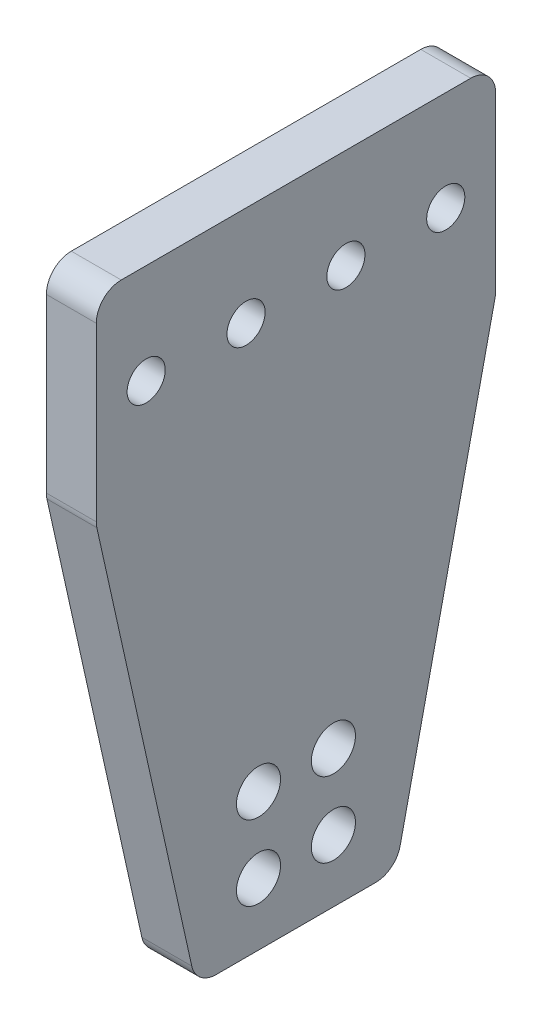
ISO-10303-21;
HEADER;
FILE_DESCRIPTION(('STEP AP214'),'2;1');
FILE_NAME('part.step','',(''),(''),'','','');
FILE_SCHEMA(('AUTOMOTIVE_DESIGN { 1 0 10303 214 1 1 1 1 }'));
ENDSEC;
DATA;
#1=APPLICATION_CONTEXT('core data for automotive mechanical design processes');
#2=APPLICATION_PROTOCOL_DEFINITION('international standard','automotive_design',2000,#1);
#3=PRODUCT_CONTEXT('',#1,'mechanical');
#4=PRODUCT('Part','Part','',(#3));
#5=PRODUCT_RELATED_PRODUCT_CATEGORY('part','',(#4));
#6=PRODUCT_DEFINITION_FORMATION('','',#4);
#7=PRODUCT_DEFINITION_CONTEXT('part definition',#1,'design');
#8=PRODUCT_DEFINITION('design','',#6,#7);
#9=PRODUCT_DEFINITION_SHAPE('','',#8);
#10=(LENGTH_UNIT() NAMED_UNIT(*) SI_UNIT(.MILLI.,.METRE.));
#11=(NAMED_UNIT(*) PLANE_ANGLE_UNIT() SI_UNIT($,.RADIAN.));
#12=(NAMED_UNIT(*) SI_UNIT($,.STERADIAN.) SOLID_ANGLE_UNIT());
#13=UNCERTAINTY_MEASURE_WITH_UNIT(LENGTH_MEASURE(1.E-05),#10,'distance_accuracy_value','');
#14=(GEOMETRIC_REPRESENTATION_CONTEXT(3) GLOBAL_UNCERTAINTY_ASSIGNED_CONTEXT((#13)) GLOBAL_UNIT_ASSIGNED_CONTEXT((#10,
#11,#12)) REPRESENTATION_CONTEXT('',''));
#15=CARTESIAN_POINT('',(0.,0.,0.));
#16=DIRECTION('',(0.,0.,1.));
#17=DIRECTION('',(1.,0.,0.));
#18=AXIS2_PLACEMENT_3D('',#15,#16,#17);
#19=CARTESIAN_POINT('',(-285.75,-53.975,1117.6));
#20=DIRECTION('',(0.,-0.216930457818659,0.976187060183952));
#21=DIRECTION('',(0.,-0.976187060183952,-0.216930457818659));
#22=AXIS2_PLACEMENT_3D('',#19,#20,#21);
#23=PLANE('',#22);
#24=DIRECTION('',(0.,-0.976187060183952,-0.216930457818659));
#25=VECTOR('',#24,1.);
#26=CARTESIAN_POINT('',(-279.4,-53.975,1117.6));
#27=LINE('',#26,#25);
#28=CARTESIAN_POINT('',(-279.4,-25.740227377622,1123.87439391608));
#29=VERTEX_POINT('',#28);
#30=CARTESIAN_POINT('',(-279.4,-80.0637542035742,1111.80249906587));
#31=VERTEX_POINT('',#30);
#32=EDGE_CURVE('E195',#29,#31,#27,.T.);
#33=ORIENTED_EDGE('',*,*,#32,.F.);
#34=DIRECTION('',(1.,0.,0.));
#35=VECTOR('',#34,1.);
#36=CARTESIAN_POINT('',(-285.75,-25.740227377622,1123.87439391608));
#37=LINE('',#36,#35);
#38=CARTESIAN_POINT('',(-285.75,-25.740227377622,1123.87439391608));
#39=VERTEX_POINT('',#38);
#40=EDGE_CURVE('E157',#29,#39,#37,.F.);
#41=ORIENTED_EDGE('',*,*,#40,.T.);
#42=DIRECTION('',(0.,-0.976187060183952,-0.216930457818659));
#43=VECTOR('',#42,1.);
#44=CARTESIAN_POINT('',(-285.75,-53.975,1117.6));
#45=LINE('',#44,#43);
#46=CARTESIAN_POINT('',(-285.75,-80.0637542035742,1111.80249906587));
#47=VERTEX_POINT('',#46);
#48=EDGE_CURVE('E222',#39,#47,#45,.T.);
#49=ORIENTED_EDGE('',*,*,#48,.T.);
#50=DIRECTION('',(1.,0.,0.));
#51=VECTOR('',#50,1.);
#52=CARTESIAN_POINT('',(-285.75,-80.0637542035742,1111.80249906587));
#53=LINE('',#52,#51);
#54=EDGE_CURVE('E154',#47,#31,#53,.T.);
#55=ORIENTED_EDGE('',*,*,#54,.T.);
#56=EDGE_LOOP('',(#33,#41,#49,#55));
#57=FACE_BOUND('',#56,.T.);
#58=ADVANCED_FACE('F17',(#57),#23,.T.);
#59=CARTESIAN_POINT('',(-285.75,-12.7,1123.95));
#60=DIRECTION('',(0.,0.,1.));
#61=DIRECTION('',(1.,0.,0.));
#62=AXIS2_PLACEMENT_3D('',#59,#60,#61);
#63=PLANE('',#62);
#64=DIRECTION('',(0.,-1.,0.));
#65=VECTOR('',#64,1.);
#66=CARTESIAN_POINT('',(-285.75,-12.7,1123.95));
#67=LINE('',#66,#65);
#68=CARTESIAN_POINT('',(-285.75,-3.175,1123.95));
#69=VERTEX_POINT('',#68);
#70=CARTESIAN_POINT('',(-285.75,-25.0514731740477,1123.95));
#71=VERTEX_POINT('',#70);
#72=EDGE_CURVE('E238',#69,#71,#67,.T.);
#73=ORIENTED_EDGE('',*,*,#72,.T.);
#74=DIRECTION('',(1.,0.,0.));
#75=VECTOR('',#74,1.);
#76=CARTESIAN_POINT('',(-285.75,-25.0514731740477,1123.95));
#77=LINE('',#76,#75);
#78=CARTESIAN_POINT('',(-279.4,-25.0514731740477,1123.95));
#79=VERTEX_POINT('',#78);
#80=EDGE_CURVE('E130',#71,#79,#77,.T.);
#81=ORIENTED_EDGE('',*,*,#80,.T.);
#82=DIRECTION('',(0.,-1.,0.));
#83=VECTOR('',#82,1.);
#84=CARTESIAN_POINT('',(-279.4,-12.7,1123.95));
#85=LINE('',#84,#83);
#86=CARTESIAN_POINT('',(-279.4,-3.175,1123.95));
#87=VERTEX_POINT('',#86);
#88=EDGE_CURVE('E114',#87,#79,#85,.T.);
#89=ORIENTED_EDGE('',*,*,#88,.F.);
#90=DIRECTION('',(1.,0.,0.));
#91=VECTOR('',#90,1.);
#92=CARTESIAN_POINT('',(-285.75,-3.175,1123.95));
#93=LINE('',#92,#91);
#94=EDGE_CURVE('E127',#87,#69,#93,.F.);
#95=ORIENTED_EDGE('',*,*,#94,.T.);
#96=EDGE_LOOP('',(#73,#81,#89,#95));
#97=FACE_BOUND('',#96,.T.);
#98=ADVANCED_FACE('F126',(#97),#63,.T.);
#99=CARTESIAN_POINT('',(-285.75,0.,622.3));
#100=DIRECTION('',(0.,1.,0.));
#101=DIRECTION('',(0.,0.,1.));
#102=AXIS2_PLACEMENT_3D('',#99,#100,#101);
#103=PLANE('',#102);
#104=DIRECTION('',(0.,0.,1.));
#105=VECTOR('',#104,1.);
#106=CARTESIAN_POINT('',(-285.75,0.,622.3));
#107=LINE('',#106,#105);
#108=CARTESIAN_POINT('',(-285.75,0.,1076.325));
#109=VERTEX_POINT('',#108);
#110=CARTESIAN_POINT('',(-285.75,0.,1120.775));
#111=VERTEX_POINT('',#110);
#112=EDGE_CURVE('E240',#109,#111,#107,.T.);
#113=ORIENTED_EDGE('',*,*,#112,.T.);
#114=DIRECTION('',(1.,0.,0.));
#115=VECTOR('',#114,1.);
#116=CARTESIAN_POINT('',(-285.75,0.,1120.775));
#117=LINE('',#116,#115);
#118=CARTESIAN_POINT('',(-279.4,0.,1120.775));
#119=VERTEX_POINT('',#118);
#120=EDGE_CURVE('E11',#111,#119,#117,.T.);
#121=ORIENTED_EDGE('',*,*,#120,.T.);
#122=DIRECTION('',(0.,0.,1.));
#123=VECTOR('',#122,1.);
#124=CARTESIAN_POINT('',(-279.4,0.,622.3));
#125=LINE('',#124,#123);
#126=CARTESIAN_POINT('',(-279.4,0.,1076.325));
#127=VERTEX_POINT('',#126);
#128=EDGE_CURVE('E116',#127,#119,#125,.T.);
#129=ORIENTED_EDGE('',*,*,#128,.F.);
#130=DIRECTION('',(1.,0.,0.));
#131=VECTOR('',#130,1.);
#132=CARTESIAN_POINT('',(-285.75,0.,1076.325));
#133=LINE('',#132,#131);
#134=EDGE_CURVE('E26',#127,#109,#133,.F.);
#135=ORIENTED_EDGE('',*,*,#134,.T.);
#136=EDGE_LOOP('',(#113,#121,#129,#135));
#137=FACE_BOUND('',#136,.T.);
#138=ADVANCED_FACE('F282',(#137),#103,.T.);
#139=CARTESIAN_POINT('',(-285.75,-12.7,1073.15));
#140=DIRECTION('',(0.,0.,-1.));
#141=DIRECTION('',(-1.,0.,0.));
#142=AXIS2_PLACEMENT_3D('',#139,#140,#141);
#143=PLANE('',#142);
#144=DIRECTION('',(0.,1.,0.));
#145=VECTOR('',#144,1.);
#146=CARTESIAN_POINT('',(-279.4,-12.7,1073.15));
#147=LINE('',#146,#145);
#148=CARTESIAN_POINT('',(-279.4,-25.0514731740468,1073.15));
#149=VERTEX_POINT('',#148);
#150=CARTESIAN_POINT('',(-279.4,-3.175,1073.15));
#151=VERTEX_POINT('',#150);
#152=EDGE_CURVE('E209',#149,#151,#147,.T.);
#153=ORIENTED_EDGE('',*,*,#152,.F.);
#154=DIRECTION('',(1.,0.,0.));
#155=VECTOR('',#154,1.);
#156=CARTESIAN_POINT('',(-285.75,-25.0514731740468,1073.15));
#157=LINE('',#156,#155);
#158=CARTESIAN_POINT('',(-285.75,-25.0514731740468,1073.15));
#159=VERTEX_POINT('',#158);
#160=EDGE_CURVE('E177',#149,#159,#157,.F.);
#161=ORIENTED_EDGE('',*,*,#160,.T.);
#162=DIRECTION('',(0.,1.,0.));
#163=VECTOR('',#162,1.);
#164=CARTESIAN_POINT('',(-285.75,-12.7,1073.15));
#165=LINE('',#164,#163);
#166=CARTESIAN_POINT('',(-285.75,-3.175,1073.15));
#167=VERTEX_POINT('',#166);
#168=EDGE_CURVE('E243',#159,#167,#165,.T.);
#169=ORIENTED_EDGE('',*,*,#168,.T.);
#170=DIRECTION('',(1.,0.,0.));
#171=VECTOR('',#170,1.);
#172=CARTESIAN_POINT('',(-285.75,-3.175,1073.15));
#173=LINE('',#172,#171);
#174=EDGE_CURVE('E174',#167,#151,#173,.T.);
#175=ORIENTED_EDGE('',*,*,#174,.T.);
#176=EDGE_LOOP('',(#153,#161,#169,#175));
#177=FACE_BOUND('',#176,.T.);
#178=ADVANCED_FACE('F323',(#177),#143,.T.);
#179=CARTESIAN_POINT('',(-285.75,-53.975,1079.5));
#180=DIRECTION('',(0.,-0.216930457818652,-0.976187060183954));
#181=DIRECTION('',(0.,0.976187060183954,-0.216930457818652));
#182=AXIS2_PLACEMENT_3D('',#179,#180,#181);
#183=PLANE('',#182);
#184=DIRECTION('',(0.,0.976187060183954,-0.216930457818652));
#185=VECTOR('',#184,1.);
#186=CARTESIAN_POINT('',(-285.75,-53.975,1079.5));
#187=LINE('',#186,#185);
#188=CARTESIAN_POINT('',(-285.75,-80.0637542035742,1085.29750093413));
#189=VERTEX_POINT('',#188);
#190=CARTESIAN_POINT('',(-285.75,-25.740227377621,1073.22560608392));
#191=VERTEX_POINT('',#190);
#192=EDGE_CURVE('E226',#189,#191,#187,.T.);
#193=ORIENTED_EDGE('',*,*,#192,.T.);
#194=DIRECTION('',(1.,0.,0.));
#195=VECTOR('',#194,1.);
#196=CARTESIAN_POINT('',(-285.75,-25.740227377621,1073.22560608392));
#197=LINE('',#196,#195);
#198=CARTESIAN_POINT('',(-279.4,-25.740227377621,1073.22560608392));
#199=VERTEX_POINT('',#198);
#200=EDGE_CURVE('E171',#191,#199,#197,.T.);
#201=ORIENTED_EDGE('',*,*,#200,.T.);
#202=DIRECTION('',(0.,0.976187060183954,-0.216930457818652));
#203=VECTOR('',#202,1.);
#204=CARTESIAN_POINT('',(-279.4,-53.975,1079.5));
#205=LINE('',#204,#203);
#206=CARTESIAN_POINT('',(-279.4,-80.0637542035742,1085.29750093413));
#207=VERTEX_POINT('',#206);
#208=EDGE_CURVE('E199',#207,#199,#205,.T.);
#209=ORIENTED_EDGE('',*,*,#208,.F.);
#210=DIRECTION('',(1.,0.,0.));
#211=VECTOR('',#210,1.);
#212=CARTESIAN_POINT('',(-285.75,-80.0637542035742,1085.29750093413));
#213=LINE('',#212,#211);
#214=EDGE_CURVE('E169',#207,#189,#213,.F.);
#215=ORIENTED_EDGE('',*,*,#214,.T.);
#216=EDGE_LOOP('',(#193,#201,#209,#215));
#217=FACE_BOUND('',#216,.T.);
#218=ADVANCED_FACE('F286',(#217),#183,.T.);
#219=CARTESIAN_POINT('',(-285.75,-12.7,1092.2));
#220=DIRECTION('',(1.,0.,0.));
#221=DIRECTION('',(0.,0.,-1.));
#222=AXIS2_PLACEMENT_3D('',#219,#220,#221);
#223=CYLINDRICAL_SURFACE('',#222,2.4257);
#224=CARTESIAN_POINT('',(-285.75,-12.7,1092.2));
#225=DIRECTION('',(-1.,0.,0.));
#226=DIRECTION('',(0.,0.,1.));
#227=AXIS2_PLACEMENT_3D('',#224,#225,#226);
#228=CIRCLE('',#227,2.4257);
#229=CARTESIAN_POINT('',(-285.75,-12.7,1094.6257));
#230=VERTEX_POINT('',#229);
#231=EDGE_CURVE('E140',#230,#230,#228,.T.);
#232=ORIENTED_EDGE('',*,*,#231,.T.);
#233=EDGE_LOOP('',(#232));
#234=FACE_BOUND('',#233,.T.);
#235=CARTESIAN_POINT('',(-279.4,-12.7,1092.2));
#236=DIRECTION('',(-1.,0.,0.));
#237=DIRECTION('',(0.,0.,1.));
#238=AXIS2_PLACEMENT_3D('',#235,#236,#237);
#239=CIRCLE('',#238,2.4257);
#240=CARTESIAN_POINT('',(-279.4,-12.7,1094.6257));
#241=VERTEX_POINT('',#240);
#242=EDGE_CURVE('E217',#241,#241,#239,.T.);
#243=ORIENTED_EDGE('',*,*,#242,.F.);
#244=EDGE_LOOP('',(#243));
#245=FACE_BOUND('',#244,.T.);
#246=ADVANCED_FACE('F254',(#234,#245),#223,.F.);
#247=CARTESIAN_POINT('',(-285.75,-12.7,1104.9));
#248=DIRECTION('',(1.,0.,0.));
#249=DIRECTION('',(0.,0.,-1.));
#250=AXIS2_PLACEMENT_3D('',#247,#248,#249);
#251=CYLINDRICAL_SURFACE('',#250,2.4257);
#252=CARTESIAN_POINT('',(-285.75,-12.7,1104.9));
#253=DIRECTION('',(-1.,0.,0.));
#254=DIRECTION('',(0.,0.,1.));
#255=AXIS2_PLACEMENT_3D('',#252,#253,#254);
#256=CIRCLE('',#255,2.4257);
#257=CARTESIAN_POINT('',(-285.75,-12.7,1107.3257));
#258=VERTEX_POINT('',#257);
#259=EDGE_CURVE('E249',#258,#258,#256,.T.);
#260=ORIENTED_EDGE('',*,*,#259,.T.);
#261=EDGE_LOOP('',(#260));
#262=FACE_BOUND('',#261,.T.);
#263=CARTESIAN_POINT('',(-279.4,-12.7,1104.9));
#264=DIRECTION('',(-1.,0.,0.));
#265=DIRECTION('',(0.,0.,1.));
#266=AXIS2_PLACEMENT_3D('',#263,#264,#265);
#267=CIRCLE('',#266,2.4257);
#268=CARTESIAN_POINT('',(-279.4,-12.7,1107.3257));
#269=VERTEX_POINT('',#268);
#270=EDGE_CURVE('E215',#269,#269,#267,.T.);
#271=ORIENTED_EDGE('',*,*,#270,.F.);
#272=EDGE_LOOP('',(#271));
#273=FACE_BOUND('',#272,.T.);
#274=ADVANCED_FACE('F343',(#262,#273),#251,.F.);
#275=CARTESIAN_POINT('',(-285.75,-12.7,1117.6));
#276=DIRECTION('',(1.,0.,0.));
#277=DIRECTION('',(0.,0.,-1.));
#278=AXIS2_PLACEMENT_3D('',#275,#276,#277);
#279=CYLINDRICAL_SURFACE('',#278,2.4257);
#280=CARTESIAN_POINT('',(-285.75,-12.7,1117.6));
#281=DIRECTION('',(-1.,0.,0.));
#282=DIRECTION('',(0.,0.,1.));
#283=AXIS2_PLACEMENT_3D('',#280,#281,#282);
#284=CIRCLE('',#283,2.4257);
#285=CARTESIAN_POINT('',(-285.75,-12.7,1120.0257));
#286=VERTEX_POINT('',#285);
#287=EDGE_CURVE('E246',#286,#286,#284,.T.);
#288=ORIENTED_EDGE('',*,*,#287,.T.);
#289=EDGE_LOOP('',(#288));
#290=FACE_BOUND('',#289,.T.);
#291=CARTESIAN_POINT('',(-279.4,-12.7,1117.6));
#292=DIRECTION('',(-1.,0.,0.));
#293=DIRECTION('',(0.,0.,1.));
#294=AXIS2_PLACEMENT_3D('',#291,#292,#293);
#295=CIRCLE('',#294,2.4257);
#296=CARTESIAN_POINT('',(-279.4,-12.7,1120.0257));
#297=VERTEX_POINT('',#296);
#298=EDGE_CURVE('E212',#297,#297,#295,.T.);
#299=ORIENTED_EDGE('',*,*,#298,.F.);
#300=EDGE_LOOP('',(#299));
#301=FACE_BOUND('',#300,.T.);
#302=ADVANCED_FACE('F273',(#290,#301),#279,.F.);
#303=CARTESIAN_POINT('',(-285.75,-82.55,1098.55));
#304=DIRECTION('',(0.,-1.,0.));
#305=DIRECTION('',(0.,0.,-1.));
#306=AXIS2_PLACEMENT_3D('',#303,#304,#305);
#307=PLANE('',#306);
#308=DIRECTION('',(0.,0.,-1.));
#309=VECTOR('',#308,1.);
#310=CARTESIAN_POINT('',(-285.75,-82.55,1098.55));
#311=LINE('',#310,#309);
#312=CARTESIAN_POINT('',(-285.75,-82.55,1108.70310514979));
#313=VERTEX_POINT('',#312);
#314=CARTESIAN_POINT('',(-285.75,-82.55,1088.39689485021));
#315=VERTEX_POINT('',#314);
#316=EDGE_CURVE('E232',#313,#315,#311,.T.);
#317=ORIENTED_EDGE('',*,*,#316,.T.);
#318=DIRECTION('',(1.,0.,0.));
#319=VECTOR('',#318,1.);
#320=CARTESIAN_POINT('',(-285.75,-82.55,1088.39689485021));
#321=LINE('',#320,#319);
#322=CARTESIAN_POINT('',(-279.4,-82.55,1088.39689485021));
#323=VERTEX_POINT('',#322);
#324=EDGE_CURVE('E180',#315,#323,#321,.T.);
#325=ORIENTED_EDGE('',*,*,#324,.T.);
#326=DIRECTION('',(0.,0.,-1.));
#327=VECTOR('',#326,1.);
#328=CARTESIAN_POINT('',(-279.4,-82.55,1098.55));
#329=LINE('',#328,#327);
#330=CARTESIAN_POINT('',(-279.4,-82.55,1108.70310514979));
#331=VERTEX_POINT('',#330);
#332=EDGE_CURVE('E131',#331,#323,#329,.T.);
#333=ORIENTED_EDGE('',*,*,#332,.F.);
#334=DIRECTION('',(1.,0.,0.));
#335=VECTOR('',#334,1.);
#336=CARTESIAN_POINT('',(-285.75,-82.55,1108.70310514979));
#337=LINE('',#336,#335);
#338=EDGE_CURVE('E41',#331,#313,#337,.F.);
#339=ORIENTED_EDGE('',*,*,#338,.T.);
#340=EDGE_LOOP('',(#317,#325,#333,#339));
#341=FACE_BOUND('',#340,.T.);
#342=ADVANCED_FACE('F267',(#341),#307,.T.);
#343=CARTESIAN_POINT('',(-285.75,-12.7,1079.5));
#344=DIRECTION('',(1.,0.,0.));
#345=DIRECTION('',(0.,0.,-1.));
#346=AXIS2_PLACEMENT_3D('',#343,#344,#345);
#347=CYLINDRICAL_SURFACE('',#346,2.4257);
#348=CARTESIAN_POINT('',(-285.75,-12.7,1079.5));
#349=DIRECTION('',(-1.,0.,0.));
#350=DIRECTION('',(0.,0.,1.));
#351=AXIS2_PLACEMENT_3D('',#348,#349,#350);
#352=CIRCLE('',#351,2.4257);
#353=CARTESIAN_POINT('',(-285.75,-12.7,1081.9257));
#354=VERTEX_POINT('',#353);
#355=EDGE_CURVE('E136',#354,#354,#352,.T.);
#356=ORIENTED_EDGE('',*,*,#355,.T.);
#357=EDGE_LOOP('',(#356));
#358=FACE_BOUND('',#357,.T.);
#359=CARTESIAN_POINT('',(-279.4,-12.7,1079.5));
#360=DIRECTION('',(-1.,0.,0.));
#361=DIRECTION('',(0.,0.,1.));
#362=AXIS2_PLACEMENT_3D('',#359,#360,#361);
#363=CIRCLE('',#362,2.4257);
#364=CARTESIAN_POINT('',(-279.4,-12.7,1081.9257));
#365=VERTEX_POINT('',#364);
#366=EDGE_CURVE('E143',#365,#365,#363,.T.);
#367=ORIENTED_EDGE('',*,*,#366,.F.);
#368=EDGE_LOOP('',(#367));
#369=FACE_BOUND('',#368,.T.);
#370=ADVANCED_FACE('F260',(#358,#369),#347,.F.);
#371=CARTESIAN_POINT('',(-285.75,-41.275,622.3));
#372=DIRECTION('',(-1.,0.,0.));
#373=DIRECTION('',(0.,-1.,0.));
#374=AXIS2_PLACEMENT_3D('',#371,#372,#373);
#375=PLANE('',#374);
#376=CARTESIAN_POINT('',(-285.75,-74.6125,1093.7875));
#377=DIRECTION('',(1.,0.,0.));
#378=DIRECTION('',(0.,0.,-1.));
#379=AXIS2_PLACEMENT_3D('',#376,#377,#378);
#380=CIRCLE('',#379,2.8067);
#381=CARTESIAN_POINT('',(-285.75,-74.6125,1090.9808));
#382=VERTEX_POINT('',#381);
#383=EDGE_CURVE('E447',#382,#382,#380,.T.);
#384=ORIENTED_EDGE('',*,*,#383,.T.);
#385=EDGE_LOOP('',(#384));
#386=FACE_BOUND('',#385,.T.);
#387=CARTESIAN_POINT('',(-285.75,-65.0875,1093.7875));
#388=DIRECTION('',(1.,0.,0.));
#389=DIRECTION('',(0.,0.,-1.));
#390=AXIS2_PLACEMENT_3D('',#387,#388,#389);
#391=CIRCLE('',#390,2.8067);
#392=CARTESIAN_POINT('',(-285.75,-65.0875,1090.9808));
#393=VERTEX_POINT('',#392);
#394=EDGE_CURVE('E448',#393,#393,#391,.T.);
#395=ORIENTED_EDGE('',*,*,#394,.T.);
#396=EDGE_LOOP('',(#395));
#397=FACE_BOUND('',#396,.T.);
#398=CARTESIAN_POINT('',(-285.75,-65.0875,1103.3125));
#399=DIRECTION('',(1.,0.,0.));
#400=DIRECTION('',(0.,0.,-1.));
#401=AXIS2_PLACEMENT_3D('',#398,#399,#400);
#402=CIRCLE('',#401,2.8067);
#403=CARTESIAN_POINT('',(-285.75,-65.0875,1100.5058));
#404=VERTEX_POINT('',#403);
#405=EDGE_CURVE('E450',#404,#404,#402,.T.);
#406=ORIENTED_EDGE('',*,*,#405,.T.);
#407=EDGE_LOOP('',(#406));
#408=FACE_BOUND('',#407,.T.);
#409=CARTESIAN_POINT('',(-285.75,-74.6125,1103.3125));
#410=DIRECTION('',(1.,0.,0.));
#411=DIRECTION('',(0.,0.,-1.));
#412=AXIS2_PLACEMENT_3D('',#409,#410,#411);
#413=CIRCLE('',#412,2.8067);
#414=CARTESIAN_POINT('',(-285.75,-74.6125,1100.5058));
#415=VERTEX_POINT('',#414);
#416=EDGE_CURVE('E188',#415,#415,#413,.T.);
#417=ORIENTED_EDGE('',*,*,#416,.T.);
#418=EDGE_LOOP('',(#417));
#419=FACE_BOUND('',#418,.T.);
#420=ORIENTED_EDGE('',*,*,#48,.F.);
#421=CARTESIAN_POINT('',(-285.75,-25.0514731740477,1120.775));
#422=DIRECTION('',(-1.,0.,0.));
#423=DIRECTION('',(0.,0.,1.));
#424=AXIS2_PLACEMENT_3D('',#421,#422,#423);
#425=CIRCLE('',#424,3.175);
#426=EDGE_CURVE('E167',#39,#71,#425,.T.);
#427=ORIENTED_EDGE('',*,*,#426,.T.);
#428=ORIENTED_EDGE('',*,*,#72,.F.);
#429=CARTESIAN_POINT('',(-285.75,-3.175,1120.775));
#430=DIRECTION('',(-1.,0.,0.));
#431=DIRECTION('',(0.,0.,1.));
#432=AXIS2_PLACEMENT_3D('',#429,#430,#431);
#433=CIRCLE('',#432,3.175);
#434=EDGE_CURVE('E135',#69,#111,#433,.T.);
#435=ORIENTED_EDGE('',*,*,#434,.T.);
#436=ORIENTED_EDGE('',*,*,#112,.F.);
#437=CARTESIAN_POINT('',(-285.75,-3.175,1076.325));
#438=DIRECTION('',(-1.,0.,0.));
#439=DIRECTION('',(0.,0.,1.));
#440=AXIS2_PLACEMENT_3D('',#437,#438,#439);
#441=CIRCLE('',#440,3.175);
#442=EDGE_CURVE('E159',#109,#167,#441,.T.);
#443=ORIENTED_EDGE('',*,*,#442,.T.);
#444=ORIENTED_EDGE('',*,*,#168,.F.);
#445=CARTESIAN_POINT('',(-285.75,-25.0514731740468,1076.325));
#446=DIRECTION('',(-1.,0.,0.));
#447=DIRECTION('',(0.,0.,1.));
#448=AXIS2_PLACEMENT_3D('',#445,#446,#447);
#449=CIRCLE('',#448,3.175);
#450=EDGE_CURVE('E165',#159,#191,#449,.T.);
#451=ORIENTED_EDGE('',*,*,#450,.T.);
#452=ORIENTED_EDGE('',*,*,#192,.F.);
#453=CARTESIAN_POINT('',(-285.75,-79.375,1088.39689485021));
#454=DIRECTION('',(-1.,0.,0.));
#455=DIRECTION('',(0.,0.,1.));
#456=AXIS2_PLACEMENT_3D('',#453,#454,#455);
#457=CIRCLE('',#456,3.175);
#458=EDGE_CURVE('E34',#189,#315,#457,.T.);
#459=ORIENTED_EDGE('',*,*,#458,.T.);
#460=ORIENTED_EDGE('',*,*,#316,.F.);
#461=CARTESIAN_POINT('',(-285.75,-79.375,1108.70310514979));
#462=DIRECTION('',(-1.,0.,0.));
#463=DIRECTION('',(0.,0.,1.));
#464=AXIS2_PLACEMENT_3D('',#461,#462,#463);
#465=CIRCLE('',#464,3.175);
#466=EDGE_CURVE('E162',#313,#47,#465,.T.);
#467=ORIENTED_EDGE('',*,*,#466,.T.);
#468=EDGE_LOOP('',(#420,#427,#428,#435,#436,#443,#444,#451,#452,#459,#460,#467));
#469=FACE_BOUND('',#468,.T.);
#470=ORIENTED_EDGE('',*,*,#287,.F.);
#471=EDGE_LOOP('',(#470));
#472=FACE_BOUND('',#471,.T.);
#473=ORIENTED_EDGE('',*,*,#259,.F.);
#474=EDGE_LOOP('',(#473));
#475=FACE_BOUND('',#474,.T.);
#476=ORIENTED_EDGE('',*,*,#231,.F.);
#477=EDGE_LOOP('',(#476));
#478=FACE_BOUND('',#477,.T.);
#479=ORIENTED_EDGE('',*,*,#355,.F.);
#480=EDGE_LOOP('',(#479));
#481=FACE_BOUND('',#480,.T.);
#482=ADVANCED_FACE('F257',(#386,#397,#408,#419,#469,#472,#475,#478,#481),#375,.T.);
#483=CARTESIAN_POINT('',(-279.4,-41.275,622.3));
#484=DIRECTION('',(-1.,0.,0.));
#485=DIRECTION('',(0.,-1.,0.));
#486=AXIS2_PLACEMENT_3D('',#483,#484,#485);
#487=PLANE('',#486);
#488=CARTESIAN_POINT('',(-279.4,-74.6125,1093.7875));
#489=DIRECTION('',(-1.,0.,0.));
#490=DIRECTION('',(0.,0.,1.));
#491=AXIS2_PLACEMENT_3D('',#488,#489,#490);
#492=CIRCLE('',#491,2.8067);
#493=CARTESIAN_POINT('',(-279.4,-74.6125,1096.5942));
#494=VERTEX_POINT('',#493);
#495=EDGE_CURVE('E21',#494,#494,#492,.F.);
#496=ORIENTED_EDGE('',*,*,#495,.F.);
#497=EDGE_LOOP('',(#496));
#498=FACE_BOUND('',#497,.T.);
#499=CARTESIAN_POINT('',(-279.4,-65.0875,1093.7875));
#500=DIRECTION('',(-1.,0.,0.));
#501=DIRECTION('',(0.,0.,1.));
#502=AXIS2_PLACEMENT_3D('',#499,#500,#501);
#503=CIRCLE('',#502,2.8067);
#504=CARTESIAN_POINT('',(-279.4,-65.0875,1096.5942));
#505=VERTEX_POINT('',#504);
#506=EDGE_CURVE('E190',#505,#505,#503,.F.);
#507=ORIENTED_EDGE('',*,*,#506,.F.);
#508=EDGE_LOOP('',(#507));
#509=FACE_BOUND('',#508,.T.);
#510=CARTESIAN_POINT('',(-279.4,-65.0875,1103.3125));
#511=DIRECTION('',(-1.,0.,0.));
#512=DIRECTION('',(0.,0.,1.));
#513=AXIS2_PLACEMENT_3D('',#510,#511,#512);
#514=CIRCLE('',#513,2.8067);
#515=CARTESIAN_POINT('',(-279.4,-65.0875,1106.1192));
#516=VERTEX_POINT('',#515);
#517=EDGE_CURVE('E187',#516,#516,#514,.F.);
#518=ORIENTED_EDGE('',*,*,#517,.F.);
#519=EDGE_LOOP('',(#518));
#520=FACE_BOUND('',#519,.T.);
#521=CARTESIAN_POINT('',(-279.4,-74.6125,1103.3125));
#522=DIRECTION('',(-1.,0.,0.));
#523=DIRECTION('',(0.,0.,1.));
#524=AXIS2_PLACEMENT_3D('',#521,#522,#523);
#525=CIRCLE('',#524,2.8067);
#526=CARTESIAN_POINT('',(-279.4,-74.6125,1106.1192));
#527=VERTEX_POINT('',#526);
#528=EDGE_CURVE('E184',#527,#527,#525,.F.);
#529=ORIENTED_EDGE('',*,*,#528,.F.);
#530=EDGE_LOOP('',(#529));
#531=FACE_BOUND('',#530,.T.);
#532=ORIENTED_EDGE('',*,*,#88,.T.);
#533=CARTESIAN_POINT('',(-279.4,-25.0514731740477,1120.775));
#534=DIRECTION('',(-1.,0.,0.));
#535=DIRECTION('',(0.,0.,1.));
#536=AXIS2_PLACEMENT_3D('',#533,#534,#535);
#537=CIRCLE('',#536,3.175);
#538=EDGE_CURVE('E152',#79,#29,#537,.F.);
#539=ORIENTED_EDGE('',*,*,#538,.T.);
#540=ORIENTED_EDGE('',*,*,#32,.T.);
#541=CARTESIAN_POINT('',(-279.4,-79.375,1108.70310514979));
#542=DIRECTION('',(-1.,0.,0.));
#543=DIRECTION('',(0.,0.,1.));
#544=AXIS2_PLACEMENT_3D('',#541,#542,#543);
#545=CIRCLE('',#544,3.175);
#546=EDGE_CURVE('E120',#31,#331,#545,.F.);
#547=ORIENTED_EDGE('',*,*,#546,.T.);
#548=ORIENTED_EDGE('',*,*,#332,.T.);
#549=CARTESIAN_POINT('',(-279.4,-79.375,1088.39689485021));
#550=DIRECTION('',(-1.,0.,0.));
#551=DIRECTION('',(0.,0.,1.));
#552=AXIS2_PLACEMENT_3D('',#549,#550,#551);
#553=CIRCLE('',#552,3.175);
#554=EDGE_CURVE('E148',#323,#207,#553,.F.);
#555=ORIENTED_EDGE('',*,*,#554,.T.);
#556=ORIENTED_EDGE('',*,*,#208,.T.);
#557=CARTESIAN_POINT('',(-279.4,-25.0514731740468,1076.325));
#558=DIRECTION('',(-1.,0.,0.));
#559=DIRECTION('',(0.,0.,1.));
#560=AXIS2_PLACEMENT_3D('',#557,#558,#559);
#561=CIRCLE('',#560,3.175);
#562=EDGE_CURVE('E150',#199,#149,#561,.F.);
#563=ORIENTED_EDGE('',*,*,#562,.T.);
#564=ORIENTED_EDGE('',*,*,#152,.T.);
#565=CARTESIAN_POINT('',(-279.4,-3.175,1076.325));
#566=DIRECTION('',(-1.,0.,0.));
#567=DIRECTION('',(0.,0.,1.));
#568=AXIS2_PLACEMENT_3D('',#565,#566,#567);
#569=CIRCLE('',#568,3.175);
#570=EDGE_CURVE('E121',#151,#127,#569,.F.);
#571=ORIENTED_EDGE('',*,*,#570,.T.);
#572=ORIENTED_EDGE('',*,*,#128,.T.);
#573=CARTESIAN_POINT('',(-279.4,-3.175,1120.775));
#574=DIRECTION('',(-1.,0.,0.));
#575=DIRECTION('',(0.,0.,1.));
#576=AXIS2_PLACEMENT_3D('',#573,#574,#575);
#577=CIRCLE('',#576,3.175);
#578=EDGE_CURVE('E110',#119,#87,#577,.F.);
#579=ORIENTED_EDGE('',*,*,#578,.T.);
#580=EDGE_LOOP('',(#532,#539,#540,#547,#548,#555,#556,#563,#564,#571,#572,#579));
#581=FACE_BOUND('',#580,.T.);
#582=ORIENTED_EDGE('',*,*,#298,.T.);
#583=EDGE_LOOP('',(#582));
#584=FACE_BOUND('',#583,.T.);
#585=ORIENTED_EDGE('',*,*,#270,.T.);
#586=EDGE_LOOP('',(#585));
#587=FACE_BOUND('',#586,.T.);
#588=ORIENTED_EDGE('',*,*,#242,.T.);
#589=EDGE_LOOP('',(#588));
#590=FACE_BOUND('',#589,.T.);
#591=ORIENTED_EDGE('',*,*,#366,.T.);
#592=EDGE_LOOP('',(#591));
#593=FACE_BOUND('',#592,.T.);
#594=ADVANCED_FACE('F112',(#498,#509,#520,#531,#581,#584,#587,#590,#593),#487,.F.);
#595=CARTESIAN_POINT('',(-285.75,-25.0514731740477,1120.775));
#596=DIRECTION('',(1.,0.,0.));
#597=DIRECTION('',(0.,0.,-1.));
#598=AXIS2_PLACEMENT_3D('',#595,#596,#597);
#599=CYLINDRICAL_SURFACE('',#598,3.175);
#600=ORIENTED_EDGE('',*,*,#426,.F.);
#601=ORIENTED_EDGE('',*,*,#40,.F.);
#602=ORIENTED_EDGE('',*,*,#538,.F.);
#603=ORIENTED_EDGE('',*,*,#80,.F.);
#604=EDGE_LOOP('',(#600,#601,#602,#603));
#605=FACE_BOUND('',#604,.T.);
#606=ADVANCED_FACE('F287',(#605),#599,.T.);
#607=CARTESIAN_POINT('',(-285.75,-25.0514731740468,1076.325));
#608=DIRECTION('',(1.,0.,0.));
#609=DIRECTION('',(0.,0.,-1.));
#610=AXIS2_PLACEMENT_3D('',#607,#608,#609);
#611=CYLINDRICAL_SURFACE('',#610,3.175);
#612=ORIENTED_EDGE('',*,*,#450,.F.);
#613=ORIENTED_EDGE('',*,*,#160,.F.);
#614=ORIENTED_EDGE('',*,*,#562,.F.);
#615=ORIENTED_EDGE('',*,*,#200,.F.);
#616=EDGE_LOOP('',(#612,#613,#614,#615));
#617=FACE_BOUND('',#616,.T.);
#618=ADVANCED_FACE('F290',(#617),#611,.T.);
#619=CARTESIAN_POINT('',(-285.75,-79.375,1088.39689485021));
#620=DIRECTION('',(1.,0.,0.));
#621=DIRECTION('',(0.,0.,-1.));
#622=AXIS2_PLACEMENT_3D('',#619,#620,#621);
#623=CYLINDRICAL_SURFACE('',#622,3.175);
#624=ORIENTED_EDGE('',*,*,#458,.F.);
#625=ORIENTED_EDGE('',*,*,#214,.F.);
#626=ORIENTED_EDGE('',*,*,#554,.F.);
#627=ORIENTED_EDGE('',*,*,#324,.F.);
#628=EDGE_LOOP('',(#624,#625,#626,#627));
#629=FACE_BOUND('',#628,.T.);
#630=ADVANCED_FACE('F294',(#629),#623,.T.);
#631=CARTESIAN_POINT('',(-285.75,-79.375,1108.70310514979));
#632=DIRECTION('',(1.,0.,0.));
#633=DIRECTION('',(0.,0.,-1.));
#634=AXIS2_PLACEMENT_3D('',#631,#632,#633);
#635=CYLINDRICAL_SURFACE('',#634,3.175);
#636=ORIENTED_EDGE('',*,*,#466,.F.);
#637=ORIENTED_EDGE('',*,*,#338,.F.);
#638=ORIENTED_EDGE('',*,*,#546,.F.);
#639=ORIENTED_EDGE('',*,*,#54,.F.);
#640=EDGE_LOOP('',(#636,#637,#638,#639));
#641=FACE_BOUND('',#640,.T.);
#642=ADVANCED_FACE('F298',(#641),#635,.T.);
#643=CARTESIAN_POINT('',(-285.75,-3.175,1120.775));
#644=DIRECTION('',(1.,0.,0.));
#645=DIRECTION('',(0.,0.,-1.));
#646=AXIS2_PLACEMENT_3D('',#643,#644,#645);
#647=CYLINDRICAL_SURFACE('',#646,3.175);
#648=ORIENTED_EDGE('',*,*,#434,.F.);
#649=ORIENTED_EDGE('',*,*,#94,.F.);
#650=ORIENTED_EDGE('',*,*,#578,.F.);
#651=ORIENTED_EDGE('',*,*,#120,.F.);
#652=EDGE_LOOP('',(#648,#649,#650,#651));
#653=FACE_BOUND('',#652,.T.);
#654=ADVANCED_FACE('F134',(#653),#647,.T.);
#655=CARTESIAN_POINT('',(-285.75,-3.175,1076.325));
#656=DIRECTION('',(1.,0.,0.));
#657=DIRECTION('',(0.,0.,-1.));
#658=AXIS2_PLACEMENT_3D('',#655,#656,#657);
#659=CYLINDRICAL_SURFACE('',#658,3.175);
#660=ORIENTED_EDGE('',*,*,#442,.F.);
#661=ORIENTED_EDGE('',*,*,#134,.F.);
#662=ORIENTED_EDGE('',*,*,#570,.F.);
#663=ORIENTED_EDGE('',*,*,#174,.F.);
#664=EDGE_LOOP('',(#660,#661,#662,#663));
#665=FACE_BOUND('',#664,.T.);
#666=ADVANCED_FACE('F19',(#665),#659,.T.);
#667=CARTESIAN_POINT('',(-285.75,-74.6125,1103.3125));
#668=DIRECTION('',(1.,0.,0.));
#669=DIRECTION('',(0.,0.,-1.));
#670=AXIS2_PLACEMENT_3D('',#667,#668,#669);
#671=CYLINDRICAL_SURFACE('',#670,2.8067);
#672=ORIENTED_EDGE('',*,*,#416,.F.);
#673=EDGE_LOOP('',(#672));
#674=FACE_BOUND('',#673,.T.);
#675=ORIENTED_EDGE('',*,*,#528,.T.);
#676=EDGE_LOOP('',(#675));
#677=FACE_BOUND('',#676,.T.);
#678=ADVANCED_FACE('F306',(#674,#677),#671,.F.);
#679=CARTESIAN_POINT('',(-285.75,-65.0875,1103.3125));
#680=DIRECTION('',(1.,0.,0.));
#681=DIRECTION('',(0.,0.,-1.));
#682=AXIS2_PLACEMENT_3D('',#679,#680,#681);
#683=CYLINDRICAL_SURFACE('',#682,2.8067);
#684=ORIENTED_EDGE('',*,*,#405,.F.);
#685=EDGE_LOOP('',(#684));
#686=FACE_BOUND('',#685,.T.);
#687=ORIENTED_EDGE('',*,*,#517,.T.);
#688=EDGE_LOOP('',(#687));
#689=FACE_BOUND('',#688,.T.);
#690=ADVANCED_FACE('F311',(#686,#689),#683,.F.);
#691=CARTESIAN_POINT('',(-285.75,-65.0875,1093.7875));
#692=DIRECTION('',(1.,0.,0.));
#693=DIRECTION('',(0.,0.,-1.));
#694=AXIS2_PLACEMENT_3D('',#691,#692,#693);
#695=CYLINDRICAL_SURFACE('',#694,2.8067);
#696=ORIENTED_EDGE('',*,*,#394,.F.);
#697=EDGE_LOOP('',(#696));
#698=FACE_BOUND('',#697,.T.);
#699=ORIENTED_EDGE('',*,*,#506,.T.);
#700=EDGE_LOOP('',(#699));
#701=FACE_BOUND('',#700,.T.);
#702=ADVANCED_FACE('F427',(#698,#701),#695,.F.);
#703=CARTESIAN_POINT('',(-285.75,-74.6125,1093.7875));
#704=DIRECTION('',(1.,0.,0.));
#705=DIRECTION('',(0.,0.,-1.));
#706=AXIS2_PLACEMENT_3D('',#703,#704,#705);
#707=CYLINDRICAL_SURFACE('',#706,2.8067);
#708=ORIENTED_EDGE('',*,*,#383,.F.);
#709=EDGE_LOOP('',(#708));
#710=FACE_BOUND('',#709,.T.);
#711=ORIENTED_EDGE('',*,*,#495,.T.);
#712=EDGE_LOOP('',(#711));
#713=FACE_BOUND('',#712,.T.);
#714=ADVANCED_FACE('F435',(#710,#713),#707,.F.);
#715=CLOSED_SHELL('',(#58,#98,#138,#178,#218,#246,#274,#302,#342,#370,#482,#594,#606,#618,#630,
#642,#654,#666,#678,#690,#702,#714));
#716=MANIFOLD_SOLID_BREP('B1',#715);
#717=ADVANCED_BREP_SHAPE_REPRESENTATION('',(#18,#716),#14);
#718=SHAPE_DEFINITION_REPRESENTATION(#9,#717);
ENDSEC;
END-ISO-10303-21;
